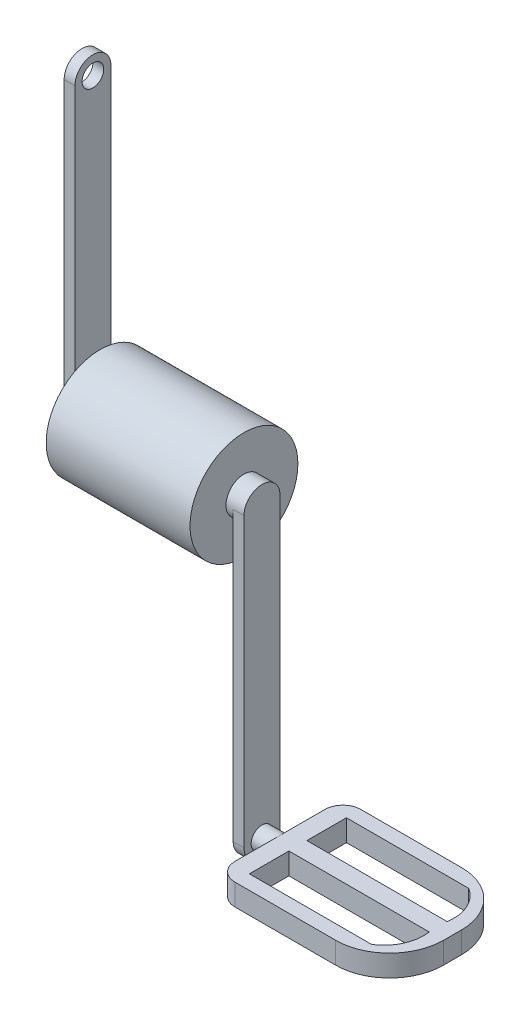
ISO-10303-21;
HEADER;
FILE_DESCRIPTION(('STEP AP214'),'2;1');
FILE_NAME('part.step','',(''),(''),'','','');
FILE_SCHEMA(('AUTOMOTIVE_DESIGN { 1 0 10303 214 1 1 1 1 }'));
ENDSEC;
DATA;
#1=APPLICATION_CONTEXT('core data for automotive mechanical design processes');
#2=APPLICATION_PROTOCOL_DEFINITION('international standard','automotive_design',2000,#1);
#3=PRODUCT_CONTEXT('',#1,'mechanical');
#4=PRODUCT('Part','Part','',(#3));
#5=PRODUCT_RELATED_PRODUCT_CATEGORY('part','',(#4));
#6=PRODUCT_DEFINITION_FORMATION('','',#4);
#7=PRODUCT_DEFINITION_CONTEXT('part definition',#1,'design');
#8=PRODUCT_DEFINITION('design','',#6,#7);
#9=PRODUCT_DEFINITION_SHAPE('','',#8);
#10=(LENGTH_UNIT() NAMED_UNIT(*) SI_UNIT(.MILLI.,.METRE.));
#11=(NAMED_UNIT(*) PLANE_ANGLE_UNIT() SI_UNIT($,.RADIAN.));
#12=(NAMED_UNIT(*) SI_UNIT($,.STERADIAN.) SOLID_ANGLE_UNIT());
#13=UNCERTAINTY_MEASURE_WITH_UNIT(LENGTH_MEASURE(1.E-05),#10,'distance_accuracy_value','');
#14=(GEOMETRIC_REPRESENTATION_CONTEXT(3) GLOBAL_UNCERTAINTY_ASSIGNED_CONTEXT((#13)) GLOBAL_UNIT_ASSIGNED_CONTEXT((#10,
#11,#12)) REPRESENTATION_CONTEXT('',''));
#15=CARTESIAN_POINT('',(0.,0.,0.));
#16=DIRECTION('',(0.,0.,1.));
#17=DIRECTION('',(1.,0.,0.));
#18=AXIS2_PLACEMENT_3D('',#15,#16,#17);
#19=CARTESIAN_POINT('',(30.,-80.,0.));
#20=DIRECTION('',(-1.,0.,0.));
#21=DIRECTION('',(0.,0.,1.));
#22=AXIS2_PLACEMENT_3D('',#19,#20,#21);
#23=CYLINDRICAL_SURFACE('',#22,3.00000000000001);
#24=CARTESIAN_POINT('',(30.,-80.,0.));
#25=DIRECTION('',(-1.,0.,0.));
#26=DIRECTION('',(0.,0.,1.));
#27=AXIS2_PLACEMENT_3D('',#24,#25,#26);
#28=CIRCLE('',#27,3.00000000000001);
#29=CARTESIAN_POINT('',(30.,-77.,0.));
#30=VERTEX_POINT('',#29);
#31=CARTESIAN_POINT('',(30.,-83.,0.));
#32=VERTEX_POINT('',#31);
#33=EDGE_CURVE('E272',#30,#32,#28,.T.);
#34=ORIENTED_EDGE('',*,*,#33,.T.);
#35=EDGE_CURVE('E276',#32,#30,#28,.T.);
#36=ORIENTED_EDGE('',*,*,#35,.T.);
#37=EDGE_LOOP('',(#34,#36));
#38=FACE_BOUND('',#37,.T.);
#39=CARTESIAN_POINT('',(22.,-80.,0.));
#40=DIRECTION('',(-1.,0.,0.));
#41=DIRECTION('',(0.,0.,1.));
#42=AXIS2_PLACEMENT_3D('',#39,#40,#41);
#43=CIRCLE('',#42,3.00000000000001);
#44=CARTESIAN_POINT('',(22.,-80.,3.00000000000001));
#45=VERTEX_POINT('',#44);
#46=EDGE_CURVE('E271',#45,#45,#43,.T.);
#47=ORIENTED_EDGE('',*,*,#46,.F.);
#48=EDGE_LOOP('',(#47));
#49=FACE_BOUND('',#48,.T.);
#50=ADVANCED_FACE('F59',(#38,#49),#23,.T.);
#51=CARTESIAN_POINT('',(22.,-80.,0.));
#52=DIRECTION('',(-1.,0.,0.));
#53=DIRECTION('',(0.,0.,1.));
#54=AXIS2_PLACEMENT_3D('',#51,#52,#53);
#55=PLANE('',#54);
#56=ORIENTED_EDGE('',*,*,#46,.T.);
#57=EDGE_LOOP('',(#56));
#58=FACE_BOUND('',#57,.T.);
#59=ADVANCED_FACE('F367',(#58),#55,.T.);
#60=CARTESIAN_POINT('',(30.,0.,0.));
#61=DIRECTION('',(1.,0.,0.));
#62=DIRECTION('',(0.,0.,-1.));
#63=AXIS2_PLACEMENT_3D('',#60,#61,#62);
#64=PLANE('',#63);
#65=DIRECTION('',(0.,0.,1.));
#66=VECTOR('',#65,1.);
#67=CARTESIAN_POINT('',(30.,-77.,17.5));
#68=LINE('',#67,#66);
#69=CARTESIAN_POINT('',(30.,-77.,-12.5));
#70=VERTEX_POINT('',#69);
#71=EDGE_CURVE('E252',#70,#30,#68,.T.);
#72=ORIENTED_EDGE('',*,*,#71,.F.);
#73=DIRECTION('',(0.,1.,0.));
#74=VECTOR('',#73,1.);
#75=CARTESIAN_POINT('',(30.,0.,-12.5));
#76=LINE('',#75,#74);
#77=CARTESIAN_POINT('',(30.,-83.,-12.5));
#78=VERTEX_POINT('',#77);
#79=EDGE_CURVE('E12',#70,#78,#76,.F.);
#80=ORIENTED_EDGE('',*,*,#79,.T.);
#81=DIRECTION('',(0.,0.,-1.));
#82=VECTOR('',#81,1.);
#83=CARTESIAN_POINT('',(30.,-83.,17.5));
#84=LINE('',#83,#82);
#85=EDGE_CURVE('E247',#32,#78,#84,.T.);
#86=ORIENTED_EDGE('',*,*,#85,.F.);
#87=ORIENTED_EDGE('',*,*,#33,.F.);
#88=EDGE_LOOP('',(#72,#80,#86,#87));
#89=FACE_BOUND('',#88,.T.);
#90=ADVANCED_FACE('F336',(#89),#64,.F.);
#91=CARTESIAN_POINT('',(78.,-77.,17.5));
#92=DIRECTION('',(0.,0.,-1.));
#93=DIRECTION('',(-1.,0.,0.));
#94=AXIS2_PLACEMENT_3D('',#91,#92,#93);
#95=PLANE('',#94);
#96=DIRECTION('',(-1.,0.,0.));
#97=VECTOR('',#96,1.);
#98=CARTESIAN_POINT('',(78.,-77.,17.5));
#99=LINE('',#98,#97);
#100=CARTESIAN_POINT('',(63.,-77.,17.5));
#101=VERTEX_POINT('',#100);
#102=CARTESIAN_POINT('',(35.,-77.,17.5));
#103=VERTEX_POINT('',#102);
#104=EDGE_CURVE('E255',#101,#103,#99,.T.);
#105=ORIENTED_EDGE('',*,*,#104,.T.);
#106=DIRECTION('',(0.,-1.,0.));
#107=VECTOR('',#106,1.);
#108=CARTESIAN_POINT('',(35.,-77.,17.5));
#109=LINE('',#108,#107);
#110=CARTESIAN_POINT('',(35.,-83.,17.5));
#111=VERTEX_POINT('',#110);
#112=EDGE_CURVE('E296',#103,#111,#109,.T.);
#113=ORIENTED_EDGE('',*,*,#112,.T.);
#114=DIRECTION('',(-1.,0.,0.));
#115=VECTOR('',#114,1.);
#116=CARTESIAN_POINT('',(78.,-83.,17.5));
#117=LINE('',#116,#115);
#118=CARTESIAN_POINT('',(63.,-83.,17.5));
#119=VERTEX_POINT('',#118);
#120=EDGE_CURVE('E268',#119,#111,#117,.T.);
#121=ORIENTED_EDGE('',*,*,#120,.F.);
#122=DIRECTION('',(0.,-1.,0.));
#123=VECTOR('',#122,1.);
#124=CARTESIAN_POINT('',(63.,-77.,17.5));
#125=LINE('',#124,#123);
#126=EDGE_CURVE('E288',#119,#101,#125,.F.);
#127=ORIENTED_EDGE('',*,*,#126,.T.);
#128=EDGE_LOOP('',(#105,#113,#121,#127));
#129=FACE_BOUND('',#128,.T.);
#130=ADVANCED_FACE('F352',(#129),#95,.F.);
#131=CARTESIAN_POINT('',(78.,-83.,17.5));
#132=DIRECTION('',(0.,1.,0.));
#133=DIRECTION('',(0.,0.,1.));
#134=AXIS2_PLACEMENT_3D('',#131,#132,#133);
#135=PLANE('',#134);
#136=DIRECTION('',(1.,0.,0.));
#137=VECTOR('',#136,1.);
#138=CARTESIAN_POINT('',(78.,-83.,-2.5));
#139=LINE('',#138,#137);
#140=CARTESIAN_POINT('',(35.,-83.,-2.5));
#141=VERTEX_POINT('',#140);
#142=CARTESIAN_POINT('',(74.,-83.,-2.5));
#143=VERTEX_POINT('',#142);
#144=EDGE_CURVE('E241',#141,#143,#139,.T.);
#145=ORIENTED_EDGE('',*,*,#144,.T.);
#146=CARTESIAN_POINT('',(63.1315579754766,-83.,-4.19616271612576));
#147=DIRECTION('',(0.,1.,0.));
#148=DIRECTION('',(0.,0.,1.));
#149=AXIS2_PLACEMENT_3D('',#146,#147,#148);
#150=CIRCLE('',#149,11.);
#151=CARTESIAN_POINT('',(69.,-83.,-13.5));
#152=VERTEX_POINT('',#151);
#153=EDGE_CURVE('E244',#143,#152,#150,.T.);
#154=ORIENTED_EDGE('',*,*,#153,.T.);
#155=DIRECTION('',(-1.,0.,0.));
#156=VECTOR('',#155,1.);
#157=CARTESIAN_POINT('',(78.,-83.,-13.5));
#158=LINE('',#157,#156);
#159=CARTESIAN_POINT('',(35.,-83.,-13.5));
#160=VERTEX_POINT('',#159);
#161=EDGE_CURVE('E238',#152,#160,#158,.T.);
#162=ORIENTED_EDGE('',*,*,#161,.T.);
#163=DIRECTION('',(0.,0.,1.));
#164=VECTOR('',#163,1.);
#165=CARTESIAN_POINT('',(35.,-83.,17.5));
#166=LINE('',#165,#164);
#167=EDGE_CURVE('E182',#160,#141,#166,.T.);
#168=ORIENTED_EDGE('',*,*,#167,.T.);
#169=EDGE_LOOP('',(#145,#154,#162,#168));
#170=FACE_BOUND('',#169,.T.);
#171=DIRECTION('',(1.,0.,0.));
#172=VECTOR('',#171,1.);
#173=CARTESIAN_POINT('',(78.,-83.,13.5));
#174=LINE('',#173,#172);
#175=CARTESIAN_POINT('',(35.,-83.,13.5));
#176=VERTEX_POINT('',#175);
#177=CARTESIAN_POINT('',(69.,-83.,13.5));
#178=VERTEX_POINT('',#177);
#179=EDGE_CURVE('E232',#176,#178,#174,.T.);
#180=ORIENTED_EDGE('',*,*,#179,.T.);
#181=CARTESIAN_POINT('',(63.1315579754766,-83.,4.19616271612576));
#182=DIRECTION('',(0.,1.,0.));
#183=DIRECTION('',(0.,0.,1.));
#184=AXIS2_PLACEMENT_3D('',#181,#182,#183);
#185=CIRCLE('',#184,11.);
#186=CARTESIAN_POINT('',(74.,-83.,2.5));
#187=VERTEX_POINT('',#186);
#188=EDGE_CURVE('E235',#178,#187,#185,.T.);
#189=ORIENTED_EDGE('',*,*,#188,.T.);
#190=DIRECTION('',(-1.,0.,0.));
#191=VECTOR('',#190,1.);
#192=CARTESIAN_POINT('',(78.,-83.,2.5));
#193=LINE('',#192,#191);
#194=CARTESIAN_POINT('',(35.,-83.,2.5));
#195=VERTEX_POINT('',#194);
#196=EDGE_CURVE('E206',#187,#195,#193,.T.);
#197=ORIENTED_EDGE('',*,*,#196,.T.);
#198=DIRECTION('',(0.,0.,1.));
#199=VECTOR('',#198,1.);
#200=CARTESIAN_POINT('',(35.,-83.,17.5));
#201=LINE('',#200,#199);
#202=EDGE_CURVE('E229',#195,#176,#201,.T.);
#203=ORIENTED_EDGE('',*,*,#202,.T.);
#204=EDGE_LOOP('',(#180,#189,#197,#203));
#205=FACE_BOUND('',#204,.T.);
#206=ORIENTED_EDGE('',*,*,#120,.T.);
#207=CARTESIAN_POINT('',(35.,-83.,12.5));
#208=DIRECTION('',(0.,1.,0.));
#209=DIRECTION('',(0.,0.,1.));
#210=AXIS2_PLACEMENT_3D('',#207,#208,#209);
#211=CIRCLE('',#210,5.);
#212=CARTESIAN_POINT('',(30.,-83.,12.5));
#213=VERTEX_POINT('',#212);
#214=EDGE_CURVE('E301',#111,#213,#211,.F.);
#215=ORIENTED_EDGE('',*,*,#214,.T.);
#216=EDGE_CURVE('E256',#213,#32,#84,.T.);
#217=ORIENTED_EDGE('',*,*,#216,.T.);
#218=ORIENTED_EDGE('',*,*,#85,.T.);
#219=CARTESIAN_POINT('',(35.,-83.,-12.5));
#220=DIRECTION('',(0.,1.,0.));
#221=DIRECTION('',(0.,0.,1.));
#222=AXIS2_PLACEMENT_3D('',#219,#220,#221);
#223=CIRCLE('',#222,5.);
#224=CARTESIAN_POINT('',(35.,-83.,-17.5));
#225=VERTEX_POINT('',#224);
#226=EDGE_CURVE('E299',#78,#225,#223,.F.);
#227=ORIENTED_EDGE('',*,*,#226,.T.);
#228=DIRECTION('',(-1.,0.,0.));
#229=VECTOR('',#228,1.);
#230=CARTESIAN_POINT('',(78.,-83.,-17.5));
#231=LINE('',#230,#229);
#232=CARTESIAN_POINT('',(63.,-83.,-17.5));
#233=VERTEX_POINT('',#232);
#234=EDGE_CURVE('E265',#233,#225,#231,.T.);
#235=ORIENTED_EDGE('',*,*,#234,.F.);
#236=CARTESIAN_POINT('',(63.,-83.,-2.5));
#237=DIRECTION('',(0.,1.,0.));
#238=DIRECTION('',(0.,0.,1.));
#239=AXIS2_PLACEMENT_3D('',#236,#237,#238);
#240=CIRCLE('',#239,15.);
#241=CARTESIAN_POINT('',(78.,-83.,-2.5));
#242=VERTEX_POINT('',#241);
#243=EDGE_CURVE('E284',#233,#242,#240,.F.);
#244=ORIENTED_EDGE('',*,*,#243,.T.);
#245=DIRECTION('',(0.,0.,-1.));
#246=VECTOR('',#245,1.);
#247=CARTESIAN_POINT('',(78.,-83.,17.5));
#248=LINE('',#247,#246);
#249=CARTESIAN_POINT('',(78.,-83.,2.5));
#250=VERTEX_POINT('',#249);
#251=EDGE_CURVE('E248',#250,#242,#248,.T.);
#252=ORIENTED_EDGE('',*,*,#251,.F.);
#253=CARTESIAN_POINT('',(63.,-83.,2.5));
#254=DIRECTION('',(0.,1.,0.));
#255=DIRECTION('',(0.,0.,1.));
#256=AXIS2_PLACEMENT_3D('',#253,#254,#255);
#257=CIRCLE('',#256,15.);
#258=EDGE_CURVE('E286',#250,#119,#257,.F.);
#259=ORIENTED_EDGE('',*,*,#258,.T.);
#260=EDGE_LOOP('',(#206,#215,#217,#218,#227,#235,#244,#252,#259));
#261=FACE_BOUND('',#260,.T.);
#262=ADVANCED_FACE('F330',(#170,#205,#261),#135,.F.);
#263=CARTESIAN_POINT('',(78.,-77.,-17.5));
#264=DIRECTION('',(0.,0.,1.));
#265=DIRECTION('',(1.,0.,0.));
#266=AXIS2_PLACEMENT_3D('',#263,#264,#265);
#267=PLANE('',#266);
#268=ORIENTED_EDGE('',*,*,#234,.T.);
#269=DIRECTION('',(0.,1.,0.));
#270=VECTOR('',#269,1.);
#271=CARTESIAN_POINT('',(35.,-77.,-17.5));
#272=LINE('',#271,#270);
#273=CARTESIAN_POINT('',(35.,-77.,-17.5));
#274=VERTEX_POINT('',#273);
#275=EDGE_CURVE('E67',#225,#274,#272,.T.);
#276=ORIENTED_EDGE('',*,*,#275,.T.);
#277=DIRECTION('',(-1.,0.,0.));
#278=VECTOR('',#277,1.);
#279=CARTESIAN_POINT('',(78.,-77.,-17.5));
#280=LINE('',#279,#278);
#281=CARTESIAN_POINT('',(63.,-77.,-17.5));
#282=VERTEX_POINT('',#281);
#283=EDGE_CURVE('E262',#282,#274,#280,.T.);
#284=ORIENTED_EDGE('',*,*,#283,.F.);
#285=DIRECTION('',(0.,1.,0.));
#286=VECTOR('',#285,1.);
#287=CARTESIAN_POINT('',(63.,-83.,-17.5));
#288=LINE('',#287,#286);
#289=EDGE_CURVE('E294',#282,#233,#288,.F.);
#290=ORIENTED_EDGE('',*,*,#289,.T.);
#291=EDGE_LOOP('',(#268,#276,#284,#290));
#292=FACE_BOUND('',#291,.T.);
#293=ADVANCED_FACE('F312',(#292),#267,.F.);
#294=CARTESIAN_POINT('',(78.,-77.,17.5));
#295=DIRECTION('',(0.,-1.,0.));
#296=DIRECTION('',(0.,0.,-1.));
#297=AXIS2_PLACEMENT_3D('',#294,#295,#296);
#298=PLANE('',#297);
#299=DIRECTION('',(-1.,0.,0.));
#300=VECTOR('',#299,1.);
#301=CARTESIAN_POINT('',(35.,-77.,-13.5));
#302=LINE('',#301,#300);
#303=CARTESIAN_POINT('',(69.,-77.,-13.5));
#304=VERTEX_POINT('',#303);
#305=CARTESIAN_POINT('',(35.,-77.,-13.5));
#306=VERTEX_POINT('',#305);
#307=EDGE_CURVE('E189',#304,#306,#302,.T.);
#308=ORIENTED_EDGE('',*,*,#307,.F.);
#309=CARTESIAN_POINT('',(63.1315579754766,-77.,-4.19616271612576));
#310=DIRECTION('',(0.,1.,0.));
#311=DIRECTION('',(0.,0.,1.));
#312=AXIS2_PLACEMENT_3D('',#309,#310,#311);
#313=CIRCLE('',#312,11.);
#314=CARTESIAN_POINT('',(74.,-77.,-2.5));
#315=VERTEX_POINT('',#314);
#316=EDGE_CURVE('E194',#315,#304,#313,.T.);
#317=ORIENTED_EDGE('',*,*,#316,.F.);
#318=DIRECTION('',(1.,0.,0.));
#319=VECTOR('',#318,1.);
#320=CARTESIAN_POINT('',(74.,-77.,-2.5));
#321=LINE('',#320,#319);
#322=CARTESIAN_POINT('',(35.,-77.,-2.5));
#323=VERTEX_POINT('',#322);
#324=EDGE_CURVE('E199',#323,#315,#321,.T.);
#325=ORIENTED_EDGE('',*,*,#324,.F.);
#326=DIRECTION('',(0.,0.,1.));
#327=VECTOR('',#326,1.);
#328=CARTESIAN_POINT('',(35.,-77.,-2.5));
#329=LINE('',#328,#327);
#330=EDGE_CURVE('E179',#306,#323,#329,.T.);
#331=ORIENTED_EDGE('',*,*,#330,.F.);
#332=EDGE_LOOP('',(#308,#317,#325,#331));
#333=FACE_BOUND('',#332,.T.);
#334=DIRECTION('',(-1.,0.,0.));
#335=VECTOR('',#334,1.);
#336=CARTESIAN_POINT('',(74.,-77.,2.5));
#337=LINE('',#336,#335);
#338=CARTESIAN_POINT('',(74.,-77.,2.5));
#339=VERTEX_POINT('',#338);
#340=CARTESIAN_POINT('',(35.,-77.,2.5));
#341=VERTEX_POINT('',#340);
#342=EDGE_CURVE('E223',#339,#341,#337,.T.);
#343=ORIENTED_EDGE('',*,*,#342,.F.);
#344=CARTESIAN_POINT('',(63.1315579754766,-77.,4.19616271612576));
#345=DIRECTION('',(0.,1.,0.));
#346=DIRECTION('',(0.,0.,1.));
#347=AXIS2_PLACEMENT_3D('',#344,#345,#346);
#348=CIRCLE('',#347,11.);
#349=CARTESIAN_POINT('',(69.,-77.,13.5));
#350=VERTEX_POINT('',#349);
#351=EDGE_CURVE('E225',#350,#339,#348,.T.);
#352=ORIENTED_EDGE('',*,*,#351,.F.);
#353=DIRECTION('',(1.,0.,0.));
#354=VECTOR('',#353,1.);
#355=CARTESIAN_POINT('',(35.,-77.,13.5));
#356=LINE('',#355,#354);
#357=CARTESIAN_POINT('',(35.,-77.,13.5));
#358=VERTEX_POINT('',#357);
#359=EDGE_CURVE('E212',#358,#350,#356,.T.);
#360=ORIENTED_EDGE('',*,*,#359,.F.);
#361=DIRECTION('',(0.,0.,1.));
#362=VECTOR('',#361,1.);
#363=CARTESIAN_POINT('',(35.,-77.,2.5));
#364=LINE('',#363,#362);
#365=EDGE_CURVE('E220',#341,#358,#364,.T.);
#366=ORIENTED_EDGE('',*,*,#365,.F.);
#367=EDGE_LOOP('',(#343,#352,#360,#366));
#368=FACE_BOUND('',#367,.T.);
#369=CARTESIAN_POINT('',(30.,-77.,12.5));
#370=VERTEX_POINT('',#369);
#371=EDGE_CURVE('E258',#30,#370,#68,.T.);
#372=ORIENTED_EDGE('',*,*,#371,.T.);
#373=CARTESIAN_POINT('',(35.,-77.,12.5));
#374=DIRECTION('',(0.,-1.,0.));
#375=DIRECTION('',(0.,0.,-1.));
#376=AXIS2_PLACEMENT_3D('',#373,#374,#375);
#377=CIRCLE('',#376,5.);
#378=EDGE_CURVE('E307',#370,#103,#377,.F.);
#379=ORIENTED_EDGE('',*,*,#378,.T.);
#380=ORIENTED_EDGE('',*,*,#104,.F.);
#381=CARTESIAN_POINT('',(63.,-77.,2.5));
#382=DIRECTION('',(0.,-1.,0.));
#383=DIRECTION('',(0.,0.,-1.));
#384=AXIS2_PLACEMENT_3D('',#381,#382,#383);
#385=CIRCLE('',#384,15.);
#386=CARTESIAN_POINT('',(78.,-77.,2.5));
#387=VERTEX_POINT('',#386);
#388=EDGE_CURVE('E292',#101,#387,#385,.F.);
#389=ORIENTED_EDGE('',*,*,#388,.T.);
#390=DIRECTION('',(0.,0.,1.));
#391=VECTOR('',#390,1.);
#392=CARTESIAN_POINT('',(78.,-77.,17.5));
#393=LINE('',#392,#391);
#394=CARTESIAN_POINT('',(78.,-77.,-2.5));
#395=VERTEX_POINT('',#394);
#396=EDGE_CURVE('E251',#395,#387,#393,.T.);
#397=ORIENTED_EDGE('',*,*,#396,.F.);
#398=CARTESIAN_POINT('',(63.,-77.,-2.5));
#399=DIRECTION('',(0.,-1.,0.));
#400=DIRECTION('',(0.,0.,-1.));
#401=AXIS2_PLACEMENT_3D('',#398,#399,#400);
#402=CIRCLE('',#401,15.);
#403=EDGE_CURVE('E290',#395,#282,#402,.F.);
#404=ORIENTED_EDGE('',*,*,#403,.T.);
#405=ORIENTED_EDGE('',*,*,#283,.T.);
#406=CARTESIAN_POINT('',(35.,-77.,-12.5));
#407=DIRECTION('',(0.,-1.,0.));
#408=DIRECTION('',(0.,0.,-1.));
#409=AXIS2_PLACEMENT_3D('',#406,#407,#408);
#410=CIRCLE('',#409,5.);
#411=EDGE_CURVE('E305',#274,#70,#410,.F.);
#412=ORIENTED_EDGE('',*,*,#411,.T.);
#413=ORIENTED_EDGE('',*,*,#71,.T.);
#414=EDGE_LOOP('',(#372,#379,#380,#389,#397,#404,#405,#412,#413));
#415=FACE_BOUND('',#414,.T.);
#416=ADVANCED_FACE('F196',(#333,#368,#415),#298,.F.);
#417=CARTESIAN_POINT('',(78.,0.,0.));
#418=DIRECTION('',(1.,0.,0.));
#419=DIRECTION('',(0.,0.,-1.));
#420=AXIS2_PLACEMENT_3D('',#417,#418,#419);
#421=PLANE('',#420);
#422=ORIENTED_EDGE('',*,*,#396,.T.);
#423=DIRECTION('',(0.,-1.,0.));
#424=VECTOR('',#423,1.);
#425=CARTESIAN_POINT('',(78.,-83.,2.5));
#426=LINE('',#425,#424);
#427=EDGE_CURVE('E281',#387,#250,#426,.T.);
#428=ORIENTED_EDGE('',*,*,#427,.T.);
#429=ORIENTED_EDGE('',*,*,#251,.T.);
#430=DIRECTION('',(0.,1.,0.));
#431=VECTOR('',#430,1.);
#432=CARTESIAN_POINT('',(78.,-77.,-2.5));
#433=LINE('',#432,#431);
#434=EDGE_CURVE('E275',#242,#395,#433,.T.);
#435=ORIENTED_EDGE('',*,*,#434,.T.);
#436=EDGE_LOOP('',(#422,#428,#429,#435));
#437=FACE_BOUND('',#436,.T.);
#438=ADVANCED_FACE('F326',(#437),#421,.T.);
#439=ORIENTED_EDGE('',*,*,#216,.F.);
#440=DIRECTION('',(0.,-1.,0.));
#441=VECTOR('',#440,1.);
#442=CARTESIAN_POINT('',(30.,0.,12.5));
#443=LINE('',#442,#441);
#444=EDGE_CURVE('E303',#213,#370,#443,.F.);
#445=ORIENTED_EDGE('',*,*,#444,.T.);
#446=ORIENTED_EDGE('',*,*,#371,.F.);
#447=ORIENTED_EDGE('',*,*,#35,.F.);
#448=EDGE_LOOP('',(#439,#445,#446,#447));
#449=FACE_BOUND('',#448,.T.);
#450=ADVANCED_FACE('F344',(#449),#64,.F.);
#451=CARTESIAN_POINT('',(63.,0.,2.5));
#452=DIRECTION('',(0.,1.,0.));
#453=DIRECTION('',(0.,0.,1.));
#454=AXIS2_PLACEMENT_3D('',#451,#452,#453);
#455=CYLINDRICAL_SURFACE('',#454,15.);
#456=ORIENTED_EDGE('',*,*,#388,.F.);
#457=ORIENTED_EDGE('',*,*,#126,.F.);
#458=ORIENTED_EDGE('',*,*,#258,.F.);
#459=ORIENTED_EDGE('',*,*,#427,.F.);
#460=EDGE_LOOP('',(#456,#457,#458,#459));
#461=FACE_BOUND('',#460,.T.);
#462=ADVANCED_FACE('F355',(#461),#455,.T.);
#463=CARTESIAN_POINT('',(63.,0.,-2.5));
#464=DIRECTION('',(0.,-1.,0.));
#465=DIRECTION('',(0.,0.,-1.));
#466=AXIS2_PLACEMENT_3D('',#463,#464,#465);
#467=CYLINDRICAL_SURFACE('',#466,15.);
#468=ORIENTED_EDGE('',*,*,#243,.F.);
#469=ORIENTED_EDGE('',*,*,#289,.F.);
#470=ORIENTED_EDGE('',*,*,#403,.F.);
#471=ORIENTED_EDGE('',*,*,#434,.F.);
#472=EDGE_LOOP('',(#468,#469,#470,#471));
#473=FACE_BOUND('',#472,.T.);
#474=ADVANCED_FACE('F324',(#473),#467,.T.);
#475=CARTESIAN_POINT('',(35.,-77.,12.5));
#476=DIRECTION('',(0.,-1.,0.));
#477=DIRECTION('',(0.,0.,-1.));
#478=AXIS2_PLACEMENT_3D('',#475,#476,#477);
#479=CYLINDRICAL_SURFACE('',#478,5.);
#480=ORIENTED_EDGE('',*,*,#378,.F.);
#481=ORIENTED_EDGE('',*,*,#444,.F.);
#482=ORIENTED_EDGE('',*,*,#214,.F.);
#483=ORIENTED_EDGE('',*,*,#112,.F.);
#484=EDGE_LOOP('',(#480,#481,#482,#483));
#485=FACE_BOUND('',#484,.T.);
#486=ADVANCED_FACE('F347',(#485),#479,.T.);
#487=CARTESIAN_POINT('',(35.,-77.,-12.5));
#488=DIRECTION('',(0.,1.,0.));
#489=DIRECTION('',(0.,0.,1.));
#490=AXIS2_PLACEMENT_3D('',#487,#488,#489);
#491=CYLINDRICAL_SURFACE('',#490,5.);
#492=ORIENTED_EDGE('',*,*,#226,.F.);
#493=ORIENTED_EDGE('',*,*,#79,.F.);
#494=ORIENTED_EDGE('',*,*,#411,.F.);
#495=ORIENTED_EDGE('',*,*,#275,.F.);
#496=EDGE_LOOP('',(#492,#493,#494,#495));
#497=FACE_BOUND('',#496,.T.);
#498=ADVANCED_FACE('F61',(#497),#491,.T.);
#499=CARTESIAN_POINT('',(63.1315579754766,-125.,4.19616271612576));
#500=DIRECTION('',(0.,1.,0.));
#501=DIRECTION('',(0.,0.,1.));
#502=AXIS2_PLACEMENT_3D('',#499,#500,#501);
#503=CYLINDRICAL_SURFACE('',#502,11.);
#504=DIRECTION('',(0.,1.,0.));
#505=VECTOR('',#504,1.);
#506=CARTESIAN_POINT('',(69.,-125.,13.5));
#507=LINE('',#506,#505);
#508=EDGE_CURVE('E216',#178,#350,#507,.T.);
#509=ORIENTED_EDGE('',*,*,#508,.T.);
#510=ORIENTED_EDGE('',*,*,#351,.T.);
#511=DIRECTION('',(0.,1.,0.));
#512=VECTOR('',#511,1.);
#513=CARTESIAN_POINT('',(74.,-125.,2.5));
#514=LINE('',#513,#512);
#515=EDGE_CURVE('E209',#187,#339,#514,.T.);
#516=ORIENTED_EDGE('',*,*,#515,.F.);
#517=ORIENTED_EDGE('',*,*,#188,.F.);
#518=EDGE_LOOP('',(#509,#510,#516,#517));
#519=FACE_BOUND('',#518,.T.);
#520=ADVANCED_FACE('F391',(#519),#503,.F.);
#521=CARTESIAN_POINT('',(35.,-125.,13.5));
#522=DIRECTION('',(0.,0.,1.));
#523=DIRECTION('',(1.,0.,0.));
#524=AXIS2_PLACEMENT_3D('',#521,#522,#523);
#525=PLANE('',#524);
#526=DIRECTION('',(0.,1.,0.));
#527=VECTOR('',#526,1.);
#528=CARTESIAN_POINT('',(35.,-125.,13.5));
#529=LINE('',#528,#527);
#530=EDGE_CURVE('E214',#176,#358,#529,.T.);
#531=ORIENTED_EDGE('',*,*,#530,.T.);
#532=ORIENTED_EDGE('',*,*,#359,.T.);
#533=ORIENTED_EDGE('',*,*,#508,.F.);
#534=ORIENTED_EDGE('',*,*,#179,.F.);
#535=EDGE_LOOP('',(#531,#532,#533,#534));
#536=FACE_BOUND('',#535,.T.);
#537=ADVANCED_FACE('F387',(#536),#525,.F.);
#538=CARTESIAN_POINT('',(35.,-125.,2.5));
#539=DIRECTION('',(-1.,0.,0.));
#540=DIRECTION('',(0.,0.,1.));
#541=AXIS2_PLACEMENT_3D('',#538,#539,#540);
#542=PLANE('',#541);
#543=DIRECTION('',(0.,1.,0.));
#544=VECTOR('',#543,1.);
#545=CARTESIAN_POINT('',(35.,-125.,2.5));
#546=LINE('',#545,#544);
#547=EDGE_CURVE('E82',#195,#341,#546,.T.);
#548=ORIENTED_EDGE('',*,*,#547,.T.);
#549=ORIENTED_EDGE('',*,*,#365,.T.);
#550=ORIENTED_EDGE('',*,*,#530,.F.);
#551=ORIENTED_EDGE('',*,*,#202,.F.);
#552=EDGE_LOOP('',(#548,#549,#550,#551));
#553=FACE_BOUND('',#552,.T.);
#554=ADVANCED_FACE('F390',(#553),#542,.F.);
#555=CARTESIAN_POINT('',(74.,-125.,2.5));
#556=DIRECTION('',(0.,0.,-1.));
#557=DIRECTION('',(-1.,0.,0.));
#558=AXIS2_PLACEMENT_3D('',#555,#556,#557);
#559=PLANE('',#558);
#560=ORIENTED_EDGE('',*,*,#515,.T.);
#561=ORIENTED_EDGE('',*,*,#342,.T.);
#562=ORIENTED_EDGE('',*,*,#547,.F.);
#563=ORIENTED_EDGE('',*,*,#196,.F.);
#564=EDGE_LOOP('',(#560,#561,#562,#563));
#565=FACE_BOUND('',#564,.T.);
#566=ADVANCED_FACE('F395',(#565),#559,.F.);
#567=CARTESIAN_POINT('',(63.1315579754766,-125.,-4.19616271612576));
#568=DIRECTION('',(0.,1.,0.));
#569=DIRECTION('',(0.,0.,1.));
#570=AXIS2_PLACEMENT_3D('',#567,#568,#569);
#571=CYLINDRICAL_SURFACE('',#570,11.);
#572=DIRECTION('',(0.,1.,0.));
#573=VECTOR('',#572,1.);
#574=CARTESIAN_POINT('',(74.,-125.,-2.5));
#575=LINE('',#574,#573);
#576=EDGE_CURVE('E204',#143,#315,#575,.T.);
#577=ORIENTED_EDGE('',*,*,#576,.T.);
#578=ORIENTED_EDGE('',*,*,#316,.T.);
#579=DIRECTION('',(0.,1.,0.));
#580=VECTOR('',#579,1.);
#581=CARTESIAN_POINT('',(69.,-125.,-13.5));
#582=LINE('',#581,#580);
#583=EDGE_CURVE('E185',#152,#304,#582,.T.);
#584=ORIENTED_EDGE('',*,*,#583,.F.);
#585=ORIENTED_EDGE('',*,*,#153,.F.);
#586=EDGE_LOOP('',(#577,#578,#584,#585));
#587=FACE_BOUND('',#586,.T.);
#588=ADVANCED_FACE('F399',(#587),#571,.F.);
#589=CARTESIAN_POINT('',(74.,-125.,-2.5));
#590=DIRECTION('',(0.,0.,1.));
#591=DIRECTION('',(1.,0.,0.));
#592=AXIS2_PLACEMENT_3D('',#589,#590,#591);
#593=PLANE('',#592);
#594=DIRECTION('',(0.,1.,0.));
#595=VECTOR('',#594,1.);
#596=CARTESIAN_POINT('',(35.,-125.,-2.5));
#597=LINE('',#596,#595);
#598=EDGE_CURVE('E184',#141,#323,#597,.T.);
#599=ORIENTED_EDGE('',*,*,#598,.T.);
#600=ORIENTED_EDGE('',*,*,#324,.T.);
#601=ORIENTED_EDGE('',*,*,#576,.F.);
#602=ORIENTED_EDGE('',*,*,#144,.F.);
#603=EDGE_LOOP('',(#599,#600,#601,#602));
#604=FACE_BOUND('',#603,.T.);
#605=ADVANCED_FACE('F405',(#604),#593,.F.);
#606=CARTESIAN_POINT('',(35.,-125.,-2.5));
#607=DIRECTION('',(-1.,0.,0.));
#608=DIRECTION('',(0.,0.,1.));
#609=AXIS2_PLACEMENT_3D('',#606,#607,#608);
#610=PLANE('',#609);
#611=DIRECTION('',(0.,1.,0.));
#612=VECTOR('',#611,1.);
#613=CARTESIAN_POINT('',(35.,-125.,-13.5));
#614=LINE('',#613,#612);
#615=EDGE_CURVE('E74',#160,#306,#614,.T.);
#616=ORIENTED_EDGE('',*,*,#615,.T.);
#617=ORIENTED_EDGE('',*,*,#330,.T.);
#618=ORIENTED_EDGE('',*,*,#598,.F.);
#619=ORIENTED_EDGE('',*,*,#167,.F.);
#620=EDGE_LOOP('',(#616,#617,#618,#619));
#621=FACE_BOUND('',#620,.T.);
#622=ADVANCED_FACE('F176',(#621),#610,.F.);
#623=CARTESIAN_POINT('',(35.,-125.,-13.5));
#624=DIRECTION('',(0.,0.,-1.));
#625=DIRECTION('',(-1.,0.,0.));
#626=AXIS2_PLACEMENT_3D('',#623,#624,#625);
#627=PLANE('',#626);
#628=ORIENTED_EDGE('',*,*,#583,.T.);
#629=ORIENTED_EDGE('',*,*,#307,.T.);
#630=ORIENTED_EDGE('',*,*,#615,.F.);
#631=ORIENTED_EDGE('',*,*,#161,.F.);
#632=EDGE_LOOP('',(#628,#629,#630,#631));
#633=FACE_BOUND('',#632,.T.);
#634=ADVANCED_FACE('F190',(#633),#627,.F.);
#635=CLOSED_SHELL('',(#50,#59,#90,#130,#262,#293,#416,#438,#450,#462,#474,#486,#498,#520,#537,
#554,#566,#588,#605,#622,#634));
#636=MANIFOLD_SOLID_BREP('B2',#635);
#637=CARTESIAN_POINT('',(20.,0.,0.));
#638=DIRECTION('',(-1.,0.,0.));
#639=DIRECTION('',(0.,0.,1.));
#640=AXIS2_PLACEMENT_3D('',#637,#638,#639);
#641=CYLINDRICAL_SURFACE('',#640,15.);
#642=CARTESIAN_POINT('',(20.,0.,0.));
#643=DIRECTION('',(1.,0.,0.));
#644=DIRECTION('',(0.,0.,-1.));
#645=AXIS2_PLACEMENT_3D('',#642,#643,#644);
#646=CIRCLE('',#645,15.);
#647=CARTESIAN_POINT('',(20.,0.,-15.));
#648=VERTEX_POINT('',#647);
#649=EDGE_CURVE('E713',#648,#648,#646,.T.);
#650=ORIENTED_EDGE('',*,*,#649,.F.);
#651=EDGE_LOOP('',(#650));
#652=FACE_BOUND('',#651,.T.);
#653=CARTESIAN_POINT('',(-20.,0.,0.));
#654=DIRECTION('',(1.,0.,0.));
#655=DIRECTION('',(0.,0.,-1.));
#656=AXIS2_PLACEMENT_3D('',#653,#654,#655);
#657=CIRCLE('',#656,15.);
#658=CARTESIAN_POINT('',(-20.,0.,-15.));
#659=VERTEX_POINT('',#658);
#660=EDGE_CURVE('E712',#659,#659,#657,.T.);
#661=ORIENTED_EDGE('',*,*,#660,.T.);
#662=EDGE_LOOP('',(#661));
#663=FACE_BOUND('',#662,.T.);
#664=ADVANCED_FACE('F550',(#652,#663),#641,.T.);
#665=CARTESIAN_POINT('',(20.,0.,0.));
#666=DIRECTION('',(1.,0.,0.));
#667=DIRECTION('',(0.,0.,-1.));
#668=AXIS2_PLACEMENT_3D('',#665,#666,#667);
#669=PLANE('',#668);
#670=CARTESIAN_POINT('',(20.,0.,0.));
#671=DIRECTION('',(1.,0.,0.));
#672=DIRECTION('',(0.,0.,-1.));
#673=AXIS2_PLACEMENT_3D('',#670,#671,#672);
#674=CIRCLE('',#673,5.);
#675=CARTESIAN_POINT('',(20.,0.,-5.));
#676=VERTEX_POINT('',#675);
#677=EDGE_CURVE('E706',#676,#676,#674,.F.);
#678=ORIENTED_EDGE('',*,*,#677,.T.);
#679=EDGE_LOOP('',(#678));
#680=FACE_BOUND('',#679,.T.);
#681=ORIENTED_EDGE('',*,*,#649,.T.);
#682=EDGE_LOOP('',(#681));
#683=FACE_BOUND('',#682,.T.);
#684=ADVANCED_FACE('F755',(#680,#683),#669,.T.);
#685=CARTESIAN_POINT('',(-20.,0.,0.));
#686=DIRECTION('',(1.,0.,0.));
#687=DIRECTION('',(0.,0.,-1.));
#688=AXIS2_PLACEMENT_3D('',#685,#686,#687);
#689=PLANE('',#688);
#690=CARTESIAN_POINT('',(-20.,0.,0.));
#691=DIRECTION('',(1.,0.,0.));
#692=DIRECTION('',(0.,0.,-1.));
#693=AXIS2_PLACEMENT_3D('',#690,#691,#692);
#694=CIRCLE('',#693,5.);
#695=CARTESIAN_POINT('',(-20.,0.,-5.));
#696=VERTEX_POINT('',#695);
#697=EDGE_CURVE('E717',#696,#696,#694,.F.);
#698=ORIENTED_EDGE('',*,*,#697,.F.);
#699=EDGE_LOOP('',(#698));
#700=FACE_BOUND('',#699,.T.);
#701=ORIENTED_EDGE('',*,*,#660,.F.);
#702=EDGE_LOOP('',(#701));
#703=FACE_BOUND('',#702,.T.);
#704=ADVANCED_FACE('F760',(#700,#703),#689,.F.);
#705=CARTESIAN_POINT('',(-25.,0.,0.));
#706=DIRECTION('',(1.,0.,0.));
#707=DIRECTION('',(0.,0.,-1.));
#708=AXIS2_PLACEMENT_3D('',#705,#706,#707);
#709=PLANE('',#708);
#710=CARTESIAN_POINT('',(-25.,0.,0.));
#711=DIRECTION('',(1.,0.,0.));
#712=DIRECTION('',(0.,0.,-1.));
#713=AXIS2_PLACEMENT_3D('',#710,#711,#712);
#714=CIRCLE('',#713,5.);
#715=CARTESIAN_POINT('',(-25.,0.,5.));
#716=VERTEX_POINT('',#715);
#717=CARTESIAN_POINT('',(-25.,0.,-5.));
#718=VERTEX_POINT('',#717);
#719=EDGE_CURVE('E692',#716,#718,#714,.T.);
#720=ORIENTED_EDGE('',*,*,#719,.F.);
#721=DIRECTION('',(0.,1.,0.));
#722=VECTOR('',#721,1.);
#723=CARTESIAN_POINT('',(-25.,0.,5.));
#724=LINE('',#723,#722);
#725=CARTESIAN_POINT('',(-25.,80.,5.));
#726=VERTEX_POINT('',#725);
#727=EDGE_CURVE('E646',#716,#726,#724,.T.);
#728=ORIENTED_EDGE('',*,*,#727,.T.);
#729=CARTESIAN_POINT('',(-25.,80.,0.));
#730=DIRECTION('',(-1.,0.,0.));
#731=DIRECTION('',(0.,0.,1.));
#732=AXIS2_PLACEMENT_3D('',#729,#730,#731);
#733=CIRCLE('',#732,5.00000000000002);
#734=CARTESIAN_POINT('',(-25.,79.9999993303394,-4.99999999999998));
#735=VERTEX_POINT('',#734);
#736=EDGE_CURVE('E618',#726,#735,#733,.T.);
#737=ORIENTED_EDGE('',*,*,#736,.T.);
#738=DIRECTION('',(0.,-1.,0.));
#739=VECTOR('',#738,1.);
#740=CARTESIAN_POINT('',(-25.,0.,-5.));
#741=LINE('',#740,#739);
#742=EDGE_CURVE('E642',#735,#718,#741,.T.);
#743=ORIENTED_EDGE('',*,*,#742,.T.);
#744=EDGE_LOOP('',(#720,#728,#737,#743));
#745=FACE_BOUND('',#744,.T.);
#746=CARTESIAN_POINT('',(-25.,80.,0.));
#747=DIRECTION('',(-1.,0.,0.));
#748=DIRECTION('',(0.,0.,1.));
#749=AXIS2_PLACEMENT_3D('',#746,#747,#748);
#750=CIRCLE('',#749,3.00000000000001);
#751=CARTESIAN_POINT('',(-25.,80.,3.));
#752=VERTEX_POINT('',#751);
#753=EDGE_CURVE('E914',#752,#752,#750,.T.);
#754=ORIENTED_EDGE('',*,*,#753,.F.);
#755=EDGE_LOOP('',(#754));
#756=FACE_BOUND('',#755,.T.);
#757=ADVANCED_FACE('F768',(#745,#756),#709,.F.);
#758=CARTESIAN_POINT('',(25.,0.,0.));
#759=DIRECTION('',(-1.,0.,0.));
#760=DIRECTION('',(0.,0.,1.));
#761=AXIS2_PLACEMENT_3D('',#758,#759,#760);
#762=CYLINDRICAL_SURFACE('',#761,5.);
#763=CARTESIAN_POINT('',(-22.,0.,0.));
#764=DIRECTION('',(-1.,0.,0.));
#765=DIRECTION('',(0.,0.,1.));
#766=AXIS2_PLACEMENT_3D('',#763,#764,#765);
#767=CIRCLE('',#766,5.);
#768=CARTESIAN_POINT('',(-22.,0.,5.));
#769=VERTEX_POINT('',#768);
#770=CARTESIAN_POINT('',(-22.,0.,-5.));
#771=VERTEX_POINT('',#770);
#772=EDGE_CURVE('E57',#769,#771,#767,.T.);
#773=ORIENTED_EDGE('',*,*,#772,.F.);
#774=DIRECTION('',(-1.,0.,0.));
#775=VECTOR('',#774,1.);
#776=CARTESIAN_POINT('',(-22.,0.,5.));
#777=LINE('',#776,#775);
#778=EDGE_CURVE('E624',#769,#716,#777,.T.);
#779=ORIENTED_EDGE('',*,*,#778,.T.);
#780=ORIENTED_EDGE('',*,*,#719,.T.);
#781=DIRECTION('',(-1.,0.,0.));
#782=VECTOR('',#781,1.);
#783=CARTESIAN_POINT('',(-22.,0.,-5.));
#784=LINE('',#783,#782);
#785=EDGE_CURVE('E565',#771,#718,#784,.T.);
#786=ORIENTED_EDGE('',*,*,#785,.F.);
#787=EDGE_LOOP('',(#773,#779,#780,#786));
#788=FACE_BOUND('',#787,.T.);
#789=ORIENTED_EDGE('',*,*,#697,.T.);
#790=EDGE_LOOP('',(#789));
#791=FACE_BOUND('',#790,.T.);
#792=ADVANCED_FACE('F773',(#788,#791),#762,.T.);
#793=ORIENTED_EDGE('',*,*,#677,.F.);
#794=EDGE_LOOP('',(#793));
#795=FACE_BOUND('',#794,.T.);
#796=CARTESIAN_POINT('',(22.,0.,0.));
#797=DIRECTION('',(1.,0.,0.));
#798=DIRECTION('',(0.,0.,-1.));
#799=AXIS2_PLACEMENT_3D('',#796,#797,#798);
#800=CIRCLE('',#799,5.);
#801=CARTESIAN_POINT('',(22.,0.,5.));
#802=VERTEX_POINT('',#801);
#803=CARTESIAN_POINT('',(22.,0.,-5.));
#804=VERTEX_POINT('',#803);
#805=EDGE_CURVE('E558',#802,#804,#800,.T.);
#806=ORIENTED_EDGE('',*,*,#805,.F.);
#807=DIRECTION('',(1.,0.,0.));
#808=VECTOR('',#807,1.);
#809=CARTESIAN_POINT('',(22.,0.,5.));
#810=LINE('',#809,#808);
#811=CARTESIAN_POINT('',(25.,0.,5.));
#812=VERTEX_POINT('',#811);
#813=EDGE_CURVE('E688',#802,#812,#810,.T.);
#814=ORIENTED_EDGE('',*,*,#813,.T.);
#815=CARTESIAN_POINT('',(25.,0.,0.));
#816=DIRECTION('',(1.,0.,0.));
#817=DIRECTION('',(0.,0.,-1.));
#818=AXIS2_PLACEMENT_3D('',#815,#816,#817);
#819=CIRCLE('',#818,5.);
#820=CARTESIAN_POINT('',(25.,0.,-5.));
#821=VERTEX_POINT('',#820);
#822=EDGE_CURVE('E702',#821,#812,#819,.T.);
#823=ORIENTED_EDGE('',*,*,#822,.F.);
#824=DIRECTION('',(1.,0.,0.));
#825=VECTOR('',#824,1.);
#826=CARTESIAN_POINT('',(22.,0.,-5.));
#827=LINE('',#826,#825);
#828=EDGE_CURVE('E693',#804,#821,#827,.T.);
#829=ORIENTED_EDGE('',*,*,#828,.F.);
#830=EDGE_LOOP('',(#806,#814,#823,#829));
#831=FACE_BOUND('',#830,.T.);
#832=ADVANCED_FACE('F736',(#795,#831),#762,.T.);
#833=CARTESIAN_POINT('',(25.,0.,0.));
#834=DIRECTION('',(1.,0.,0.));
#835=DIRECTION('',(0.,0.,-1.));
#836=AXIS2_PLACEMENT_3D('',#833,#834,#835);
#837=PLANE('',#836);
#838=ORIENTED_EDGE('',*,*,#822,.T.);
#839=DIRECTION('',(0.,-1.,0.));
#840=VECTOR('',#839,1.);
#841=CARTESIAN_POINT('',(25.,0.,5.));
#842=LINE('',#841,#840);
#843=CARTESIAN_POINT('',(25.,-80.,4.99999999999999));
#844=VERTEX_POINT('',#843);
#845=EDGE_CURVE('E661',#812,#844,#842,.T.);
#846=ORIENTED_EDGE('',*,*,#845,.T.);
#847=CARTESIAN_POINT('',(25.,-80.,0.));
#848=DIRECTION('',(1.,0.,0.));
#849=DIRECTION('',(0.,0.,-1.));
#850=AXIS2_PLACEMENT_3D('',#847,#848,#849);
#851=CIRCLE('',#850,4.99999999999999);
#852=CARTESIAN_POINT('',(25.,-80.,-4.99999999999999));
#853=VERTEX_POINT('',#852);
#854=EDGE_CURVE('E682',#844,#853,#851,.T.);
#855=ORIENTED_EDGE('',*,*,#854,.T.);
#856=DIRECTION('',(0.,1.,0.));
#857=VECTOR('',#856,1.);
#858=CARTESIAN_POINT('',(25.,0.,-5.));
#859=LINE('',#858,#857);
#860=EDGE_CURVE('E670',#853,#821,#859,.T.);
#861=ORIENTED_EDGE('',*,*,#860,.T.);
#862=EDGE_LOOP('',(#838,#846,#855,#861));
#863=FACE_BOUND('',#862,.T.);
#864=CARTESIAN_POINT('',(25.,-80.,0.));
#865=DIRECTION('',(1.,0.,0.));
#866=DIRECTION('',(0.,0.,-1.));
#867=AXIS2_PLACEMENT_3D('',#864,#865,#866);
#868=CIRCLE('',#867,3.00000000000001);
#869=CARTESIAN_POINT('',(25.,-80.,-3.00000000000001));
#870=VERTEX_POINT('',#869);
#871=EDGE_CURVE('E653',#870,#870,#868,.T.);
#872=ORIENTED_EDGE('',*,*,#871,.F.);
#873=EDGE_LOOP('',(#872));
#874=FACE_BOUND('',#873,.T.);
#875=ADVANCED_FACE('F738',(#863,#874),#837,.T.);
#876=CARTESIAN_POINT('',(22.,0.,5.));
#877=DIRECTION('',(0.,0.,1.));
#878=DIRECTION('',(0.,-1.,0.));
#879=AXIS2_PLACEMENT_3D('',#876,#877,#878);
#880=PLANE('',#879);
#881=ORIENTED_EDGE('',*,*,#845,.F.);
#882=ORIENTED_EDGE('',*,*,#813,.F.);
#883=DIRECTION('',(0.,-1.,0.));
#884=VECTOR('',#883,1.);
#885=CARTESIAN_POINT('',(22.,0.,5.));
#886=LINE('',#885,#884);
#887=CARTESIAN_POINT('',(22.,-80.,4.99999999999999));
#888=VERTEX_POINT('',#887);
#889=EDGE_CURVE('E665',#802,#888,#886,.T.);
#890=ORIENTED_EDGE('',*,*,#889,.T.);
#891=DIRECTION('',(1.,0.,0.));
#892=VECTOR('',#891,1.);
#893=CARTESIAN_POINT('',(22.,-80.,4.99999999999999));
#894=LINE('',#893,#892);
#895=EDGE_CURVE('E678',#888,#844,#894,.T.);
#896=ORIENTED_EDGE('',*,*,#895,.T.);
#897=EDGE_LOOP('',(#881,#882,#890,#896));
#898=FACE_BOUND('',#897,.T.);
#899=ADVANCED_FACE('F744',(#898),#880,.T.);
#900=CARTESIAN_POINT('',(22.,0.,-5.));
#901=DIRECTION('',(0.,0.,-1.));
#902=DIRECTION('',(0.,1.,0.));
#903=AXIS2_PLACEMENT_3D('',#900,#901,#902);
#904=PLANE('',#903);
#905=ORIENTED_EDGE('',*,*,#860,.F.);
#906=DIRECTION('',(1.,0.,0.));
#907=VECTOR('',#906,1.);
#908=CARTESIAN_POINT('',(22.,-80.,-4.99999999999999));
#909=LINE('',#908,#907);
#910=CARTESIAN_POINT('',(22.,-80.,-4.99999999999999));
#911=VERTEX_POINT('',#910);
#912=EDGE_CURVE('E697',#911,#853,#909,.T.);
#913=ORIENTED_EDGE('',*,*,#912,.F.);
#914=DIRECTION('',(0.,1.,0.));
#915=VECTOR('',#914,1.);
#916=CARTESIAN_POINT('',(22.,0.,-5.));
#917=LINE('',#916,#915);
#918=EDGE_CURVE('E674',#911,#804,#917,.T.);
#919=ORIENTED_EDGE('',*,*,#918,.T.);
#920=ORIENTED_EDGE('',*,*,#828,.T.);
#921=EDGE_LOOP('',(#905,#913,#919,#920));
#922=FACE_BOUND('',#921,.T.);
#923=ADVANCED_FACE('F734',(#922),#904,.T.);
#924=CARTESIAN_POINT('',(22.,-80.,0.));
#925=DIRECTION('',(1.,0.,0.));
#926=DIRECTION('',(0.,0.,-1.));
#927=AXIS2_PLACEMENT_3D('',#924,#925,#926);
#928=CYLINDRICAL_SURFACE('',#927,4.99999999999999);
#929=ORIENTED_EDGE('',*,*,#854,.F.);
#930=ORIENTED_EDGE('',*,*,#895,.F.);
#931=CARTESIAN_POINT('',(22.,-80.,0.));
#932=DIRECTION('',(1.,0.,0.));
#933=DIRECTION('',(0.,0.,-1.));
#934=AXIS2_PLACEMENT_3D('',#931,#932,#933);
#935=CIRCLE('',#934,4.99999999999999);
#936=EDGE_CURVE('E669',#888,#911,#935,.T.);
#937=ORIENTED_EDGE('',*,*,#936,.T.);
#938=ORIENTED_EDGE('',*,*,#912,.T.);
#939=EDGE_LOOP('',(#929,#930,#937,#938));
#940=FACE_BOUND('',#939,.T.);
#941=ADVANCED_FACE('F742',(#940),#928,.T.);
#942=CARTESIAN_POINT('',(22.,-80.,0.));
#943=DIRECTION('',(1.,0.,0.));
#944=DIRECTION('',(0.,0.,-1.));
#945=AXIS2_PLACEMENT_3D('',#942,#943,#944);
#946=PLANE('',#945);
#947=CARTESIAN_POINT('',(22.,-80.,0.));
#948=DIRECTION('',(1.,0.,0.));
#949=DIRECTION('',(0.,0.,-1.));
#950=AXIS2_PLACEMENT_3D('',#947,#948,#949);
#951=CIRCLE('',#950,3.00000000000001);
#952=CARTESIAN_POINT('',(22.,-80.,-3.00000000000001));
#953=VERTEX_POINT('',#952);
#954=EDGE_CURVE('E657',#953,#953,#951,.T.);
#955=ORIENTED_EDGE('',*,*,#954,.T.);
#956=EDGE_LOOP('',(#955));
#957=FACE_BOUND('',#956,.T.);
#958=ORIENTED_EDGE('',*,*,#889,.F.);
#959=ORIENTED_EDGE('',*,*,#805,.T.);
#960=ORIENTED_EDGE('',*,*,#918,.F.);
#961=ORIENTED_EDGE('',*,*,#936,.F.);
#962=EDGE_LOOP('',(#958,#959,#960,#961));
#963=FACE_BOUND('',#962,.T.);
#964=ADVANCED_FACE('F728',(#957,#963),#946,.F.);
#965=CARTESIAN_POINT('',(22.,-80.,0.));
#966=DIRECTION('',(1.,0.,0.));
#967=DIRECTION('',(0.,0.,-1.));
#968=AXIS2_PLACEMENT_3D('',#965,#966,#967);
#969=CYLINDRICAL_SURFACE('',#968,3.00000000000001);
#970=ORIENTED_EDGE('',*,*,#954,.F.);
#971=EDGE_LOOP('',(#970));
#972=FACE_BOUND('',#971,.T.);
#973=ORIENTED_EDGE('',*,*,#871,.T.);
#974=EDGE_LOOP('',(#973));
#975=FACE_BOUND('',#974,.T.);
#976=ADVANCED_FACE('F793',(#972,#975),#969,.F.);
#977=CARTESIAN_POINT('',(-22.,0.,-5.));
#978=DIRECTION('',(0.,0.,-1.));
#979=DIRECTION('',(-1.,0.,0.));
#980=AXIS2_PLACEMENT_3D('',#977,#978,#979);
#981=PLANE('',#980);
#982=ORIENTED_EDGE('',*,*,#742,.F.);
#983=DIRECTION('',(-1.,0.,0.));
#984=VECTOR('',#983,1.);
#985=CARTESIAN_POINT('',(-22.,79.9999993303394,-4.99999999999998));
#986=LINE('',#985,#984);
#987=CARTESIAN_POINT('',(-22.,79.9999993303394,-4.99999999999998));
#988=VERTEX_POINT('',#987);
#989=EDGE_CURVE('E623',#988,#735,#986,.T.);
#990=ORIENTED_EDGE('',*,*,#989,.F.);
#991=DIRECTION('',(0.,-1.,0.));
#992=VECTOR('',#991,1.);
#993=CARTESIAN_POINT('',(-22.,0.,-5.));
#994=LINE('',#993,#992);
#995=EDGE_CURVE('E631',#988,#771,#994,.T.);
#996=ORIENTED_EDGE('',*,*,#995,.T.);
#997=ORIENTED_EDGE('',*,*,#785,.T.);
#998=EDGE_LOOP('',(#982,#990,#996,#997));
#999=FACE_BOUND('',#998,.T.);
#1000=ADVANCED_FACE('F796',(#999),#981,.T.);
#1001=CARTESIAN_POINT('',(-22.,80.,0.));
#1002=DIRECTION('',(-1.,0.,0.));
#1003=DIRECTION('',(0.,0.,1.));
#1004=AXIS2_PLACEMENT_3D('',#1001,#1002,#1003);
#1005=CYLINDRICAL_SURFACE('',#1004,5.00000000000002);
#1006=ORIENTED_EDGE('',*,*,#736,.F.);
#1007=DIRECTION('',(-1.,0.,0.));
#1008=VECTOR('',#1007,1.);
#1009=CARTESIAN_POINT('',(-22.,80.,5.));
#1010=LINE('',#1009,#1008);
#1011=CARTESIAN_POINT('',(-22.,80.,5.));
#1012=VERTEX_POINT('',#1011);
#1013=EDGE_CURVE('E612',#1012,#726,#1010,.T.);
#1014=ORIENTED_EDGE('',*,*,#1013,.F.);
#1015=CARTESIAN_POINT('',(-22.,80.,0.));
#1016=DIRECTION('',(-1.,0.,0.));
#1017=DIRECTION('',(0.,0.,1.));
#1018=AXIS2_PLACEMENT_3D('',#1015,#1016,#1017);
#1019=CIRCLE('',#1018,5.00000000000002);
#1020=EDGE_CURVE('E616',#1012,#988,#1019,.T.);
#1021=ORIENTED_EDGE('',*,*,#1020,.T.);
#1022=ORIENTED_EDGE('',*,*,#989,.T.);
#1023=EDGE_LOOP('',(#1006,#1014,#1021,#1022));
#1024=FACE_BOUND('',#1023,.T.);
#1025=ADVANCED_FACE('F614',(#1024),#1005,.T.);
#1026=CARTESIAN_POINT('',(-22.,0.,5.));
#1027=DIRECTION('',(0.,0.,1.));
#1028=DIRECTION('',(1.,0.,0.));
#1029=AXIS2_PLACEMENT_3D('',#1026,#1027,#1028);
#1030=PLANE('',#1029);
#1031=ORIENTED_EDGE('',*,*,#727,.F.);
#1032=ORIENTED_EDGE('',*,*,#778,.F.);
#1033=DIRECTION('',(0.,1.,0.));
#1034=VECTOR('',#1033,1.);
#1035=CARTESIAN_POINT('',(-22.,0.,5.));
#1036=LINE('',#1035,#1034);
#1037=EDGE_CURVE('E627',#769,#1012,#1036,.T.);
#1038=ORIENTED_EDGE('',*,*,#1037,.T.);
#1039=ORIENTED_EDGE('',*,*,#1013,.T.);
#1040=EDGE_LOOP('',(#1031,#1032,#1038,#1039));
#1041=FACE_BOUND('',#1040,.T.);
#1042=ADVANCED_FACE('F628',(#1041),#1030,.T.);
#1043=CARTESIAN_POINT('',(-22.,80.,0.));
#1044=DIRECTION('',(-1.,0.,0.));
#1045=DIRECTION('',(0.,0.,1.));
#1046=AXIS2_PLACEMENT_3D('',#1043,#1044,#1045);
#1047=PLANE('',#1046);
#1048=CARTESIAN_POINT('',(-22.,80.,0.));
#1049=DIRECTION('',(-1.,0.,0.));
#1050=DIRECTION('',(0.,0.,1.));
#1051=AXIS2_PLACEMENT_3D('',#1048,#1049,#1050);
#1052=CIRCLE('',#1051,3.00000000000001);
#1053=CARTESIAN_POINT('',(-22.,80.,3.));
#1054=VERTEX_POINT('',#1053);
#1055=EDGE_CURVE('E647',#1054,#1054,#1052,.T.);
#1056=ORIENTED_EDGE('',*,*,#1055,.T.);
#1057=EDGE_LOOP('',(#1056));
#1058=FACE_BOUND('',#1057,.T.);
#1059=ORIENTED_EDGE('',*,*,#1037,.F.);
#1060=ORIENTED_EDGE('',*,*,#772,.T.);
#1061=ORIENTED_EDGE('',*,*,#995,.F.);
#1062=ORIENTED_EDGE('',*,*,#1020,.F.);
#1063=EDGE_LOOP('',(#1059,#1060,#1061,#1062));
#1064=FACE_BOUND('',#1063,.T.);
#1065=ADVANCED_FACE('F634',(#1058,#1064),#1047,.F.);
#1066=CARTESIAN_POINT('',(-22.,80.,0.));
#1067=DIRECTION('',(-1.,0.,0.));
#1068=DIRECTION('',(0.,0.,1.));
#1069=AXIS2_PLACEMENT_3D('',#1066,#1067,#1068);
#1070=CYLINDRICAL_SURFACE('',#1069,3.00000000000001);
#1071=ORIENTED_EDGE('',*,*,#1055,.F.);
#1072=EDGE_LOOP('',(#1071));
#1073=FACE_BOUND('',#1072,.T.);
#1074=ORIENTED_EDGE('',*,*,#753,.T.);
#1075=EDGE_LOOP('',(#1074));
#1076=FACE_BOUND('',#1075,.T.);
#1077=ADVANCED_FACE('F841',(#1073,#1076),#1070,.F.);
#1078=CLOSED_SHELL('',(#664,#684,#704,#757,#792,#832,#875,#899,#923,#941,#964,#976,#1000,#1025,
#1042,#1065,#1077));
#1079=MANIFOLD_SOLID_BREP('B6',#1078);
#1080=ADVANCED_BREP_SHAPE_REPRESENTATION('',(#18,#636,#1079),#14);
#1081=SHAPE_DEFINITION_REPRESENTATION(#9,#1080);
ENDSEC;
END-ISO-10303-21;
